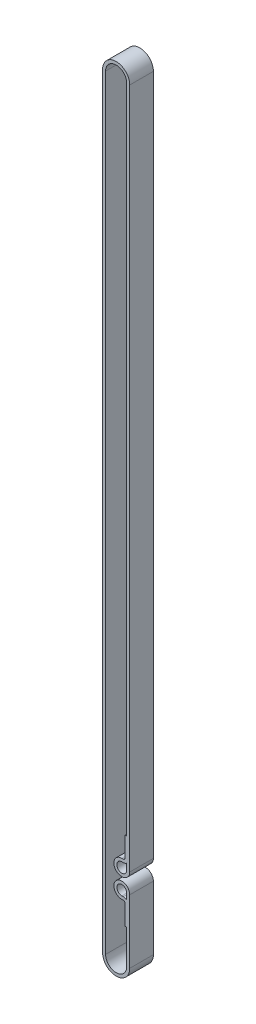
ISO-10303-21;
HEADER;
FILE_DESCRIPTION(('STEP AP214'),'2;1');
FILE_NAME('part.step','',(''),(''),'','','');
FILE_SCHEMA(('AUTOMOTIVE_DESIGN { 1 0 10303 214 1 1 1 1 }'));
ENDSEC;
DATA;
#1=APPLICATION_CONTEXT('core data for automotive mechanical design processes');
#2=APPLICATION_PROTOCOL_DEFINITION('international standard','automotive_design',2000,#1);
#3=PRODUCT_CONTEXT('',#1,'mechanical');
#4=PRODUCT('Part','Part','',(#3));
#5=PRODUCT_RELATED_PRODUCT_CATEGORY('part','',(#4));
#6=PRODUCT_DEFINITION_FORMATION('','',#4);
#7=PRODUCT_DEFINITION_CONTEXT('part definition',#1,'design');
#8=PRODUCT_DEFINITION('design','',#6,#7);
#9=PRODUCT_DEFINITION_SHAPE('','',#8);
#10=(LENGTH_UNIT() NAMED_UNIT(*) SI_UNIT(.MILLI.,.METRE.));
#11=(NAMED_UNIT(*) PLANE_ANGLE_UNIT() SI_UNIT($,.RADIAN.));
#12=(NAMED_UNIT(*) SI_UNIT($,.STERADIAN.) SOLID_ANGLE_UNIT());
#13=UNCERTAINTY_MEASURE_WITH_UNIT(LENGTH_MEASURE(1.E-05),#10,'distance_accuracy_value','');
#14=(GEOMETRIC_REPRESENTATION_CONTEXT(3) GLOBAL_UNCERTAINTY_ASSIGNED_CONTEXT((#13)) GLOBAL_UNIT_ASSIGNED_CONTEXT((#10,
#11,#12)) REPRESENTATION_CONTEXT('',''));
#15=CARTESIAN_POINT('',(0.,0.,0.));
#16=DIRECTION('',(0.,0.,1.));
#17=DIRECTION('',(1.,0.,0.));
#18=AXIS2_PLACEMENT_3D('',#15,#16,#17);
#19=CARTESIAN_POINT('',(4.591,-330.696,12.));
#20=DIRECTION('',(0.,1.,0.));
#21=DIRECTION('',(0.,0.,1.));
#22=AXIS2_PLACEMENT_3D('',#19,#20,#21);
#23=PLANE('',#22);
#24=DIRECTION('',(1.,0.,0.));
#25=VECTOR('',#24,1.);
#26=CARTESIAN_POINT('',(4.591,-330.696,0.));
#27=LINE('',#26,#25);
#28=CARTESIAN_POINT('',(4.591,-330.696,0.));
#29=VERTEX_POINT('',#28);
#30=CARTESIAN_POINT('',(5.361,-330.696,0.));
#31=VERTEX_POINT('',#30);
#32=EDGE_CURVE('E180',#29,#31,#27,.T.);
#33=ORIENTED_EDGE('',*,*,#32,.F.);
#34=DIRECTION('',(0.,0.,-1.));
#35=VECTOR('',#34,1.);
#36=CARTESIAN_POINT('',(4.591,-330.696,12.));
#37=LINE('',#36,#35);
#38=CARTESIAN_POINT('',(4.591,-330.696,12.));
#39=VERTEX_POINT('',#38);
#40=EDGE_CURVE('E11',#39,#29,#37,.T.);
#41=ORIENTED_EDGE('',*,*,#40,.F.);
#42=DIRECTION('',(1.,0.,0.));
#43=VECTOR('',#42,1.);
#44=CARTESIAN_POINT('',(4.591,-330.696,12.));
#45=LINE('',#44,#43);
#46=CARTESIAN_POINT('',(5.361,-330.696,12.));
#47=VERTEX_POINT('',#46);
#48=EDGE_CURVE('E223',#39,#47,#45,.T.);
#49=ORIENTED_EDGE('',*,*,#48,.T.);
#50=DIRECTION('',(0.,0.,1.));
#51=VECTOR('',#50,1.);
#52=CARTESIAN_POINT('',(5.361,-330.696,-400.932146129492));
#53=LINE('',#52,#51);
#54=EDGE_CURVE('E309',#31,#47,#53,.T.);
#55=ORIENTED_EDGE('',*,*,#54,.F.);
#56=EDGE_LOOP('',(#33,#41,#49,#55));
#57=FACE_BOUND('',#56,.T.);
#58=ADVANCED_FACE('F41',(#57),#23,.T.);
#59=CARTESIAN_POINT('',(4.591,-330.696,12.));
#60=DIRECTION('',(-1.,0.,0.));
#61=DIRECTION('',(0.,0.,1.));
#62=AXIS2_PLACEMENT_3D('',#59,#60,#61);
#63=PLANE('',#62);
#64=DIRECTION('',(0.,1.,0.));
#65=VECTOR('',#64,1.);
#66=CARTESIAN_POINT('',(4.591,-330.696,0.));
#67=LINE('',#66,#65);
#68=CARTESIAN_POINT('',(4.591,-340.696,0.));
#69=VERTEX_POINT('',#68);
#70=EDGE_CURVE('E183',#69,#29,#67,.T.);
#71=ORIENTED_EDGE('',*,*,#70,.F.);
#72=DIRECTION('',(0.,0.,-1.));
#73=VECTOR('',#72,1.);
#74=CARTESIAN_POINT('',(4.591,-340.696,12.));
#75=LINE('',#74,#73);
#76=CARTESIAN_POINT('',(4.591,-340.696,12.));
#77=VERTEX_POINT('',#76);
#78=EDGE_CURVE('E49',#77,#69,#75,.T.);
#79=ORIENTED_EDGE('',*,*,#78,.F.);
#80=DIRECTION('',(0.,1.,0.));
#81=VECTOR('',#80,1.);
#82=CARTESIAN_POINT('',(4.591,-330.696,12.));
#83=LINE('',#82,#81);
#84=EDGE_CURVE('E265',#77,#39,#83,.T.);
#85=ORIENTED_EDGE('',*,*,#84,.T.);
#86=ORIENTED_EDGE('',*,*,#40,.T.);
#87=EDGE_LOOP('',(#71,#79,#85,#86));
#88=FACE_BOUND('',#87,.T.);
#89=ADVANCED_FACE('F252',(#88),#63,.T.);
#90=CARTESIAN_POINT('',(3.607,-340.696,12.));
#91=DIRECTION('',(0.,0.,-1.));
#92=DIRECTION('',(-1.,0.,0.));
#93=AXIS2_PLACEMENT_3D('',#90,#91,#92);
#94=CYLINDRICAL_SURFACE('',#93,0.984000000000001);
#95=CARTESIAN_POINT('',(3.607,-340.696,0.));
#96=DIRECTION('',(0.,0.,1.));
#97=DIRECTION('',(1.,0.,0.));
#98=AXIS2_PLACEMENT_3D('',#95,#96,#97);
#99=CIRCLE('',#98,0.984000000000001);
#100=CARTESIAN_POINT('',(3.607,-341.68,0.));
#101=VERTEX_POINT('',#100);
#102=EDGE_CURVE('E187',#101,#69,#99,.T.);
#103=ORIENTED_EDGE('',*,*,#102,.F.);
#104=DIRECTION('',(0.,0.,-1.));
#105=VECTOR('',#104,1.);
#106=CARTESIAN_POINT('',(3.607,-341.68,12.));
#107=LINE('',#106,#105);
#108=CARTESIAN_POINT('',(3.607,-341.68,12.));
#109=VERTEX_POINT('',#108);
#110=EDGE_CURVE('E241',#109,#101,#107,.T.);
#111=ORIENTED_EDGE('',*,*,#110,.F.);
#112=CARTESIAN_POINT('',(3.607,-340.696,12.));
#113=DIRECTION('',(0.,0.,1.));
#114=DIRECTION('',(1.,0.,0.));
#115=AXIS2_PLACEMENT_3D('',#112,#113,#114);
#116=CIRCLE('',#115,0.984000000000001);
#117=EDGE_CURVE('E248',#109,#77,#116,.T.);
#118=ORIENTED_EDGE('',*,*,#117,.T.);
#119=ORIENTED_EDGE('',*,*,#78,.T.);
#120=EDGE_LOOP('',(#103,#111,#118,#119));
#121=FACE_BOUND('',#120,.T.);
#122=ADVANCED_FACE('F246',(#121),#94,.F.);
#123=CARTESIAN_POINT('',(2.861,-341.68,12.));
#124=DIRECTION('',(0.,1.,0.));
#125=DIRECTION('',(0.,0.,1.));
#126=AXIS2_PLACEMENT_3D('',#123,#124,#125);
#127=PLANE('',#126);
#128=DIRECTION('',(1.,0.,0.));
#129=VECTOR('',#128,1.);
#130=CARTESIAN_POINT('',(2.861,-341.68,0.));
#131=LINE('',#130,#129);
#132=CARTESIAN_POINT('',(2.861,-341.68,0.));
#133=VERTEX_POINT('',#132);
#134=EDGE_CURVE('E190',#133,#101,#131,.T.);
#135=ORIENTED_EDGE('',*,*,#134,.F.);
#136=DIRECTION('',(0.,0.,-1.));
#137=VECTOR('',#136,1.);
#138=CARTESIAN_POINT('',(2.861,-341.68,12.));
#139=LINE('',#138,#137);
#140=CARTESIAN_POINT('',(2.861,-341.68,12.));
#141=VERTEX_POINT('',#140);
#142=EDGE_CURVE('E239',#141,#133,#139,.T.);
#143=ORIENTED_EDGE('',*,*,#142,.F.);
#144=DIRECTION('',(1.,0.,0.));
#145=VECTOR('',#144,1.);
#146=CARTESIAN_POINT('',(2.861,-341.68,12.));
#147=LINE('',#146,#145);
#148=EDGE_CURVE('E262',#141,#109,#147,.T.);
#149=ORIENTED_EDGE('',*,*,#148,.T.);
#150=ORIENTED_EDGE('',*,*,#110,.T.);
#151=EDGE_LOOP('',(#135,#143,#149,#150));
#152=FACE_BOUND('',#151,.T.);
#153=ADVANCED_FACE('F259',(#152),#127,.T.);
#154=CARTESIAN_POINT('',(2.861,-345.7,12.));
#155=DIRECTION('',(0.,0.,-1.));
#156=DIRECTION('',(-1.,0.,0.));
#157=AXIS2_PLACEMENT_3D('',#154,#155,#156);
#158=CYLINDRICAL_SURFACE('',#157,4.02);
#159=CARTESIAN_POINT('',(2.861,-345.7,0.));
#160=DIRECTION('',(0.,0.,1.));
#161=DIRECTION('',(1.,0.,0.));
#162=AXIS2_PLACEMENT_3D('',#159,#160,#161);
#163=CIRCLE('',#162,4.02);
#164=CARTESIAN_POINT('',(6.881,-345.7,0.));
#165=VERTEX_POINT('',#164);
#166=EDGE_CURVE('E193',#165,#133,#163,.F.);
#167=ORIENTED_EDGE('',*,*,#166,.F.);
#168=DIRECTION('',(0.,0.,-1.));
#169=VECTOR('',#168,1.);
#170=CARTESIAN_POINT('',(6.881,-345.7,12.));
#171=LINE('',#170,#169);
#172=CARTESIAN_POINT('',(6.881,-345.7,12.));
#173=VERTEX_POINT('',#172);
#174=EDGE_CURVE('E237',#173,#165,#171,.T.);
#175=ORIENTED_EDGE('',*,*,#174,.F.);
#176=CARTESIAN_POINT('',(2.861,-345.7,12.));
#177=DIRECTION('',(0.,0.,1.));
#178=DIRECTION('',(1.,0.,0.));
#179=AXIS2_PLACEMENT_3D('',#176,#177,#178);
#180=CIRCLE('',#179,4.02);
#181=EDGE_CURVE('E267',#173,#141,#180,.F.);
#182=ORIENTED_EDGE('',*,*,#181,.T.);
#183=ORIENTED_EDGE('',*,*,#142,.T.);
#184=EDGE_LOOP('',(#167,#175,#182,#183));
#185=FACE_BOUND('',#184,.T.);
#186=ADVANCED_FACE('F755',(#185),#158,.T.);
#187=CARTESIAN_POINT('',(6.881,-345.7,12.));
#188=DIRECTION('',(1.,0.,0.));
#189=DIRECTION('',(0.,0.,-1.));
#190=AXIS2_PLACEMENT_3D('',#187,#188,#189);
#191=PLANE('',#190);
#192=DIRECTION('',(0.,1.,0.));
#193=VECTOR('',#192,1.);
#194=CARTESIAN_POINT('',(6.881,-345.7,0.));
#195=LINE('',#194,#193);
#196=CARTESIAN_POINT('',(6.881,0.,0.));
#197=VERTEX_POINT('',#196);
#198=EDGE_CURVE('E196',#197,#165,#195,.F.);
#199=ORIENTED_EDGE('',*,*,#198,.F.);
#200=DIRECTION('',(0.,0.,-1.));
#201=VECTOR('',#200,1.);
#202=CARTESIAN_POINT('',(6.881,0.,12.));
#203=LINE('',#202,#201);
#204=CARTESIAN_POINT('',(6.881,0.,12.));
#205=VERTEX_POINT('',#204);
#206=EDGE_CURVE('E235',#205,#197,#203,.T.);
#207=ORIENTED_EDGE('',*,*,#206,.F.);
#208=DIRECTION('',(0.,1.,0.));
#209=VECTOR('',#208,1.);
#210=CARTESIAN_POINT('',(6.881,-345.7,12.));
#211=LINE('',#210,#209);
#212=EDGE_CURVE('E273',#205,#173,#211,.F.);
#213=ORIENTED_EDGE('',*,*,#212,.T.);
#214=ORIENTED_EDGE('',*,*,#174,.T.);
#215=EDGE_LOOP('',(#199,#207,#213,#214));
#216=FACE_BOUND('',#215,.T.);
#217=ADVANCED_FACE('F631',(#216),#191,.T.);
#218=CARTESIAN_POINT('',(0.,0.,12.));
#219=DIRECTION('',(0.,0.,-1.));
#220=DIRECTION('',(-1.,0.,0.));
#221=AXIS2_PLACEMENT_3D('',#218,#219,#220);
#222=CYLINDRICAL_SURFACE('',#221,6.881);
#223=CARTESIAN_POINT('',(0.,0.,0.));
#224=DIRECTION('',(0.,0.,1.));
#225=DIRECTION('',(1.,0.,0.));
#226=AXIS2_PLACEMENT_3D('',#223,#224,#225);
#227=CIRCLE('',#226,6.881);
#228=CARTESIAN_POINT('',(-6.881,0.,0.));
#229=VERTEX_POINT('',#228);
#230=EDGE_CURVE('E199',#229,#197,#227,.F.);
#231=ORIENTED_EDGE('',*,*,#230,.F.);
#232=DIRECTION('',(0.,0.,-1.));
#233=VECTOR('',#232,1.);
#234=CARTESIAN_POINT('',(-6.881,0.,12.));
#235=LINE('',#234,#233);
#236=CARTESIAN_POINT('',(-6.881,0.,12.));
#237=VERTEX_POINT('',#236);
#238=EDGE_CURVE('E233',#237,#229,#235,.T.);
#239=ORIENTED_EDGE('',*,*,#238,.F.);
#240=CARTESIAN_POINT('',(0.,0.,12.));
#241=DIRECTION('',(0.,0.,1.));
#242=DIRECTION('',(1.,0.,0.));
#243=AXIS2_PLACEMENT_3D('',#240,#241,#242);
#244=CIRCLE('',#243,6.881);
#245=EDGE_CURVE('E276',#237,#205,#244,.F.);
#246=ORIENTED_EDGE('',*,*,#245,.T.);
#247=ORIENTED_EDGE('',*,*,#206,.T.);
#248=EDGE_LOOP('',(#231,#239,#246,#247));
#249=FACE_BOUND('',#248,.T.);
#250=ADVANCED_FACE('F625',(#249),#222,.T.);
#251=CARTESIAN_POINT('',(-6.881,0.,12.));
#252=DIRECTION('',(-1.,0.,0.));
#253=DIRECTION('',(0.,0.,1.));
#254=AXIS2_PLACEMENT_3D('',#251,#252,#253);
#255=PLANE('',#254);
#256=DIRECTION('',(0.,1.,0.));
#257=VECTOR('',#256,1.);
#258=CARTESIAN_POINT('',(-6.881,0.,0.));
#259=LINE('',#258,#257);
#260=CARTESIAN_POINT('',(-6.881,-388.,0.));
#261=VERTEX_POINT('',#260);
#262=EDGE_CURVE('E202',#261,#229,#259,.T.);
#263=ORIENTED_EDGE('',*,*,#262,.F.);
#264=DIRECTION('',(0.,0.,-1.));
#265=VECTOR('',#264,1.);
#266=CARTESIAN_POINT('',(-6.881,-388.,12.));
#267=LINE('',#266,#265);
#268=CARTESIAN_POINT('',(-6.881,-388.,12.));
#269=VERTEX_POINT('',#268);
#270=EDGE_CURVE('E231',#269,#261,#267,.T.);
#271=ORIENTED_EDGE('',*,*,#270,.F.);
#272=DIRECTION('',(0.,1.,0.));
#273=VECTOR('',#272,1.);
#274=CARTESIAN_POINT('',(-6.881,0.,12.));
#275=LINE('',#274,#273);
#276=EDGE_CURVE('E279',#269,#237,#275,.T.);
#277=ORIENTED_EDGE('',*,*,#276,.T.);
#278=ORIENTED_EDGE('',*,*,#238,.T.);
#279=EDGE_LOOP('',(#263,#271,#277,#278));
#280=FACE_BOUND('',#279,.T.);
#281=ADVANCED_FACE('F630',(#280),#255,.T.);
#282=CARTESIAN_POINT('',(0.,-388.,12.));
#283=DIRECTION('',(0.,0.,-1.));
#284=DIRECTION('',(-1.,0.,0.));
#285=AXIS2_PLACEMENT_3D('',#282,#283,#284);
#286=CYLINDRICAL_SURFACE('',#285,6.881);
#287=CARTESIAN_POINT('',(0.,-388.,0.));
#288=DIRECTION('',(0.,0.,1.));
#289=DIRECTION('',(1.,0.,0.));
#290=AXIS2_PLACEMENT_3D('',#287,#288,#289);
#291=CIRCLE('',#290,6.881);
#292=CARTESIAN_POINT('',(6.881,-388.,0.));
#293=VERTEX_POINT('',#292);
#294=EDGE_CURVE('E205',#293,#261,#291,.F.);
#295=ORIENTED_EDGE('',*,*,#294,.F.);
#296=DIRECTION('',(0.,0.,-1.));
#297=VECTOR('',#296,1.);
#298=CARTESIAN_POINT('',(6.881,-388.,12.));
#299=LINE('',#298,#297);
#300=CARTESIAN_POINT('',(6.881,-388.,12.));
#301=VERTEX_POINT('',#300);
#302=EDGE_CURVE('E229',#301,#293,#299,.T.);
#303=ORIENTED_EDGE('',*,*,#302,.F.);
#304=CARTESIAN_POINT('',(0.,-388.,12.));
#305=DIRECTION('',(0.,0.,1.));
#306=DIRECTION('',(1.,0.,0.));
#307=AXIS2_PLACEMENT_3D('',#304,#305,#306);
#308=CIRCLE('',#307,6.881);
#309=EDGE_CURVE('E282',#301,#269,#308,.F.);
#310=ORIENTED_EDGE('',*,*,#309,.T.);
#311=ORIENTED_EDGE('',*,*,#270,.T.);
#312=EDGE_LOOP('',(#295,#303,#310,#311));
#313=FACE_BOUND('',#312,.T.);
#314=ADVANCED_FACE('F615',(#313),#286,.T.);
#315=CARTESIAN_POINT('',(6.881,-388.,12.));
#316=DIRECTION('',(1.,0.,0.));
#317=DIRECTION('',(0.,0.,-1.));
#318=AXIS2_PLACEMENT_3D('',#315,#316,#317);
#319=PLANE('',#318);
#320=DIRECTION('',(0.,1.,0.));
#321=VECTOR('',#320,1.);
#322=CARTESIAN_POINT('',(6.881,-388.,0.));
#323=LINE('',#322,#321);
#324=CARTESIAN_POINT('',(6.881,-355.7,0.));
#325=VERTEX_POINT('',#324);
#326=EDGE_CURVE('E208',#325,#293,#323,.F.);
#327=ORIENTED_EDGE('',*,*,#326,.F.);
#328=DIRECTION('',(0.,0.,-1.));
#329=VECTOR('',#328,1.);
#330=CARTESIAN_POINT('',(6.881,-355.7,12.));
#331=LINE('',#330,#329);
#332=CARTESIAN_POINT('',(6.881,-355.7,12.));
#333=VERTEX_POINT('',#332);
#334=EDGE_CURVE('E227',#333,#325,#331,.T.);
#335=ORIENTED_EDGE('',*,*,#334,.F.);
#336=DIRECTION('',(0.,1.,0.));
#337=VECTOR('',#336,1.);
#338=CARTESIAN_POINT('',(6.881,-388.,12.));
#339=LINE('',#338,#337);
#340=EDGE_CURVE('E285',#333,#301,#339,.F.);
#341=ORIENTED_EDGE('',*,*,#340,.T.);
#342=ORIENTED_EDGE('',*,*,#302,.T.);
#343=EDGE_LOOP('',(#327,#335,#341,#342));
#344=FACE_BOUND('',#343,.T.);
#345=ADVANCED_FACE('F610',(#344),#319,.T.);
#346=CARTESIAN_POINT('',(2.861,-355.7,12.));
#347=DIRECTION('',(0.,0.,-1.));
#348=DIRECTION('',(-1.,0.,0.));
#349=AXIS2_PLACEMENT_3D('',#346,#347,#348);
#350=CYLINDRICAL_SURFACE('',#349,4.02);
#351=CARTESIAN_POINT('',(2.861,-355.7,0.));
#352=DIRECTION('',(0.,0.,1.));
#353=DIRECTION('',(1.,0.,0.));
#354=AXIS2_PLACEMENT_3D('',#351,#352,#353);
#355=CIRCLE('',#354,4.02);
#356=CARTESIAN_POINT('',(2.861,-359.72,0.));
#357=VERTEX_POINT('',#356);
#358=EDGE_CURVE('E211',#357,#325,#355,.F.);
#359=ORIENTED_EDGE('',*,*,#358,.F.);
#360=DIRECTION('',(0.,0.,-1.));
#361=VECTOR('',#360,1.);
#362=CARTESIAN_POINT('',(2.861,-359.72,12.));
#363=LINE('',#362,#361);
#364=CARTESIAN_POINT('',(2.861,-359.72,12.));
#365=VERTEX_POINT('',#364);
#366=EDGE_CURVE('E159',#365,#357,#363,.T.);
#367=ORIENTED_EDGE('',*,*,#366,.F.);
#368=CARTESIAN_POINT('',(2.861,-355.7,12.));
#369=DIRECTION('',(0.,0.,1.));
#370=DIRECTION('',(1.,0.,0.));
#371=AXIS2_PLACEMENT_3D('',#368,#369,#370);
#372=CIRCLE('',#371,4.02);
#373=EDGE_CURVE('E170',#365,#333,#372,.F.);
#374=ORIENTED_EDGE('',*,*,#373,.T.);
#375=ORIENTED_EDGE('',*,*,#334,.T.);
#376=EDGE_LOOP('',(#359,#367,#374,#375));
#377=FACE_BOUND('',#376,.T.);
#378=ADVANCED_FACE('F289',(#377),#350,.T.);
#379=CARTESIAN_POINT('',(2.861,-359.72,12.));
#380=DIRECTION('',(0.,-1.,0.));
#381=DIRECTION('',(0.,0.,-1.));
#382=AXIS2_PLACEMENT_3D('',#379,#380,#381);
#383=PLANE('',#382);
#384=DIRECTION('',(1.,0.,0.));
#385=VECTOR('',#384,1.);
#386=CARTESIAN_POINT('',(2.861,-359.72,0.));
#387=LINE('',#386,#385);
#388=CARTESIAN_POINT('',(3.607,-359.72,0.));
#389=VERTEX_POINT('',#388);
#390=EDGE_CURVE('E155',#389,#357,#387,.F.);
#391=ORIENTED_EDGE('',*,*,#390,.F.);
#392=DIRECTION('',(0.,0.,-1.));
#393=VECTOR('',#392,1.);
#394=CARTESIAN_POINT('',(3.607,-359.72,12.));
#395=LINE('',#394,#393);
#396=CARTESIAN_POINT('',(3.607,-359.72,12.));
#397=VERTEX_POINT('',#396);
#398=EDGE_CURVE('E150',#397,#389,#395,.T.);
#399=ORIENTED_EDGE('',*,*,#398,.F.);
#400=DIRECTION('',(1.,0.,0.));
#401=VECTOR('',#400,1.);
#402=CARTESIAN_POINT('',(2.861,-359.72,12.));
#403=LINE('',#402,#401);
#404=EDGE_CURVE('E153',#397,#365,#403,.F.);
#405=ORIENTED_EDGE('',*,*,#404,.T.);
#406=ORIENTED_EDGE('',*,*,#366,.T.);
#407=EDGE_LOOP('',(#391,#399,#405,#406));
#408=FACE_BOUND('',#407,.T.);
#409=ADVANCED_FACE('F152',(#408),#383,.T.);
#410=CARTESIAN_POINT('',(3.607,-360.704,12.));
#411=DIRECTION('',(0.,0.,-1.));
#412=DIRECTION('',(-1.,0.,0.));
#413=AXIS2_PLACEMENT_3D('',#410,#411,#412);
#414=CYLINDRICAL_SURFACE('',#413,0.984000000000001);
#415=CARTESIAN_POINT('',(3.607,-360.704,0.));
#416=DIRECTION('',(0.,0.,1.));
#417=DIRECTION('',(1.,0.,0.));
#418=AXIS2_PLACEMENT_3D('',#415,#416,#417);
#419=CIRCLE('',#418,0.984000000000001);
#420=CARTESIAN_POINT('',(4.591,-360.704,0.));
#421=VERTEX_POINT('',#420);
#422=EDGE_CURVE('E215',#421,#389,#419,.T.);
#423=ORIENTED_EDGE('',*,*,#422,.F.);
#424=DIRECTION('',(0.,0.,-1.));
#425=VECTOR('',#424,1.);
#426=CARTESIAN_POINT('',(4.591,-360.704,12.));
#427=LINE('',#426,#425);
#428=CARTESIAN_POINT('',(4.591,-360.704,12.));
#429=VERTEX_POINT('',#428);
#430=EDGE_CURVE('E101',#429,#421,#427,.T.);
#431=ORIENTED_EDGE('',*,*,#430,.F.);
#432=CARTESIAN_POINT('',(3.607,-360.704,12.));
#433=DIRECTION('',(0.,0.,1.));
#434=DIRECTION('',(1.,0.,0.));
#435=AXIS2_PLACEMENT_3D('',#432,#433,#434);
#436=CIRCLE('',#435,0.984000000000001);
#437=EDGE_CURVE('E167',#429,#397,#436,.T.);
#438=ORIENTED_EDGE('',*,*,#437,.T.);
#439=ORIENTED_EDGE('',*,*,#398,.T.);
#440=EDGE_LOOP('',(#423,#431,#438,#439));
#441=FACE_BOUND('',#440,.T.);
#442=ADVANCED_FACE('F172',(#441),#414,.F.);
#443=CARTESIAN_POINT('',(4.591,-370.704,12.));
#444=DIRECTION('',(-1.,0.,0.));
#445=DIRECTION('',(0.,0.,1.));
#446=AXIS2_PLACEMENT_3D('',#443,#444,#445);
#447=PLANE('',#446);
#448=DIRECTION('',(0.,1.,0.));
#449=VECTOR('',#448,1.);
#450=CARTESIAN_POINT('',(4.591,-370.704,0.));
#451=LINE('',#450,#449);
#452=CARTESIAN_POINT('',(4.591,-370.704,0.));
#453=VERTEX_POINT('',#452);
#454=EDGE_CURVE('E217',#453,#421,#451,.T.);
#455=ORIENTED_EDGE('',*,*,#454,.F.);
#456=DIRECTION('',(0.,0.,-1.));
#457=VECTOR('',#456,1.);
#458=CARTESIAN_POINT('',(4.591,-370.704,12.));
#459=LINE('',#458,#457);
#460=CARTESIAN_POINT('',(4.591,-370.704,12.));
#461=VERTEX_POINT('',#460);
#462=EDGE_CURVE('E57',#461,#453,#459,.T.);
#463=ORIENTED_EDGE('',*,*,#462,.F.);
#464=DIRECTION('',(0.,1.,0.));
#465=VECTOR('',#464,1.);
#466=CARTESIAN_POINT('',(4.591,-370.704,12.));
#467=LINE('',#466,#465);
#468=EDGE_CURVE('E173',#461,#429,#467,.T.);
#469=ORIENTED_EDGE('',*,*,#468,.T.);
#470=ORIENTED_EDGE('',*,*,#430,.T.);
#471=EDGE_LOOP('',(#455,#463,#469,#470));
#472=FACE_BOUND('',#471,.T.);
#473=ADVANCED_FACE('F292',(#472),#447,.T.);
#474=CARTESIAN_POINT('',(5.107,-370.704,12.));
#475=DIRECTION('',(0.,-1.,0.));
#476=DIRECTION('',(0.,0.,-1.));
#477=AXIS2_PLACEMENT_3D('',#474,#475,#476);
#478=PLANE('',#477);
#479=DIRECTION('',(-1.,0.,0.));
#480=VECTOR('',#479,1.);
#481=CARTESIAN_POINT('',(5.107,-370.704,0.));
#482=LINE('',#481,#480);
#483=CARTESIAN_POINT('',(5.361,-370.704,0.));
#484=VERTEX_POINT('',#483);
#485=EDGE_CURVE('E220',#484,#453,#482,.T.);
#486=ORIENTED_EDGE('',*,*,#485,.F.);
#487=DIRECTION('',(0.,0.,1.));
#488=VECTOR('',#487,1.);
#489=CARTESIAN_POINT('',(5.361,-370.704,-400.932146129492));
#490=LINE('',#489,#488);
#491=CARTESIAN_POINT('',(5.361,-370.704,12.));
#492=VERTEX_POINT('',#491);
#493=EDGE_CURVE('E403',#484,#492,#490,.T.);
#494=ORIENTED_EDGE('',*,*,#493,.T.);
#495=DIRECTION('',(-1.,0.,0.));
#496=VECTOR('',#495,1.);
#497=CARTESIAN_POINT('',(5.107,-370.704,12.));
#498=LINE('',#497,#496);
#499=EDGE_CURVE('E175',#492,#461,#498,.T.);
#500=ORIENTED_EDGE('',*,*,#499,.T.);
#501=ORIENTED_EDGE('',*,*,#462,.T.);
#502=EDGE_LOOP('',(#486,#494,#500,#501));
#503=FACE_BOUND('',#502,.T.);
#504=ADVANCED_FACE('F294',(#503),#478,.T.);
#505=CARTESIAN_POINT('',(3.607,-340.696,12.));
#506=DIRECTION('',(0.,0.,1.));
#507=DIRECTION('',(1.,0.,0.));
#508=AXIS2_PLACEMENT_3D('',#505,#506,#507);
#509=PLANE('',#508);
#510=ORIENTED_EDGE('',*,*,#499,.F.);
#511=DIRECTION('',(0.,-1.,0.));
#512=VECTOR('',#511,1.);
#513=CARTESIAN_POINT('',(5.36100000000008,0.,12.));
#514=LINE('',#513,#512);
#515=CARTESIAN_POINT('',(5.361,-388.,12.));
#516=VERTEX_POINT('',#515);
#517=EDGE_CURVE('E356',#492,#516,#514,.T.);
#518=ORIENTED_EDGE('',*,*,#517,.T.);
#519=CARTESIAN_POINT('',(0.,-388.,12.));
#520=DIRECTION('',(0.,0.,1.));
#521=DIRECTION('',(1.,0.,0.));
#522=AXIS2_PLACEMENT_3D('',#519,#520,#521);
#523=CIRCLE('',#522,5.361);
#524=CARTESIAN_POINT('',(-5.361,-388.,12.));
#525=VERTEX_POINT('',#524);
#526=EDGE_CURVE('E368',#525,#516,#523,.T.);
#527=ORIENTED_EDGE('',*,*,#526,.F.);
#528=DIRECTION('',(0.,1.,0.));
#529=VECTOR('',#528,1.);
#530=CARTESIAN_POINT('',(-5.361,0.,12.));
#531=LINE('',#530,#529);
#532=CARTESIAN_POINT('',(-5.361,0.,12.));
#533=VERTEX_POINT('',#532);
#534=EDGE_CURVE('E357',#525,#533,#531,.T.);
#535=ORIENTED_EDGE('',*,*,#534,.T.);
#536=CARTESIAN_POINT('',(0.,0.,12.));
#537=DIRECTION('',(0.,0.,1.));
#538=DIRECTION('',(1.,0.,0.));
#539=AXIS2_PLACEMENT_3D('',#536,#537,#538);
#540=CIRCLE('',#539,5.361);
#541=CARTESIAN_POINT('',(5.361,0.,12.));
#542=VERTEX_POINT('',#541);
#543=EDGE_CURVE('E355',#542,#533,#540,.T.);
#544=ORIENTED_EDGE('',*,*,#543,.F.);
#545=DIRECTION('',(0.,-1.,0.));
#546=VECTOR('',#545,1.);
#547=CARTESIAN_POINT('',(5.361,0.,12.));
#548=LINE('',#547,#546);
#549=EDGE_CURVE('E352',#542,#47,#548,.T.);
#550=ORIENTED_EDGE('',*,*,#549,.T.);
#551=ORIENTED_EDGE('',*,*,#48,.F.);
#552=ORIENTED_EDGE('',*,*,#84,.F.);
#553=ORIENTED_EDGE('',*,*,#117,.F.);
#554=ORIENTED_EDGE('',*,*,#148,.F.);
#555=ORIENTED_EDGE('',*,*,#181,.F.);
#556=ORIENTED_EDGE('',*,*,#212,.F.);
#557=ORIENTED_EDGE('',*,*,#245,.F.);
#558=ORIENTED_EDGE('',*,*,#276,.F.);
#559=ORIENTED_EDGE('',*,*,#309,.F.);
#560=ORIENTED_EDGE('',*,*,#340,.F.);
#561=ORIENTED_EDGE('',*,*,#373,.F.);
#562=ORIENTED_EDGE('',*,*,#404,.F.);
#563=ORIENTED_EDGE('',*,*,#437,.F.);
#564=ORIENTED_EDGE('',*,*,#468,.F.);
#565=EDGE_LOOP('',(#510,#518,#527,#535,#544,#550,#551,#552,#553,#554,#555,#556,#557,#558,#559,
#560,#561,#562,#563,#564));
#566=FACE_BOUND('',#565,.T.);
#567=CARTESIAN_POINT('',(2.861,-355.7,12.));
#568=DIRECTION('',(0.,0.,1.));
#569=DIRECTION('',(1.,0.,0.));
#570=AXIS2_PLACEMENT_3D('',#567,#568,#569);
#571=CIRCLE('',#570,2.5);
#572=CARTESIAN_POINT('',(5.361,-355.7,12.));
#573=VERTEX_POINT('',#572);
#574=CARTESIAN_POINT('',(2.861,-358.2,12.));
#575=VERTEX_POINT('',#574);
#576=EDGE_CURVE('E392',#573,#575,#571,.T.);
#577=ORIENTED_EDGE('',*,*,#576,.F.);
#578=DIRECTION('',(0.,-1.,0.));
#579=VECTOR('',#578,1.);
#580=CARTESIAN_POINT('',(5.3610000000001,0.,12.));
#581=LINE('',#580,#579);
#582=CARTESIAN_POINT('',(5.361,-358.916963346767,12.));
#583=VERTEX_POINT('',#582);
#584=EDGE_CURVE('E360',#573,#583,#581,.T.);
#585=ORIENTED_EDGE('',*,*,#584,.T.);
#586=CARTESIAN_POINT('',(3.607,-360.704,12.));
#587=DIRECTION('',(0.,0.,1.));
#588=DIRECTION('',(1.,0.,0.));
#589=AXIS2_PLACEMENT_3D('',#586,#587,#588);
#590=CIRCLE('',#589,2.504);
#591=CARTESIAN_POINT('',(3.607,-358.2,12.));
#592=VERTEX_POINT('',#591);
#593=EDGE_CURVE('E498',#583,#592,#590,.T.);
#594=ORIENTED_EDGE('',*,*,#593,.T.);
#595=DIRECTION('',(-1.,0.,0.));
#596=VECTOR('',#595,1.);
#597=CARTESIAN_POINT('',(0.,-358.2,12.));
#598=LINE('',#597,#596);
#599=EDGE_CURVE('E494',#592,#575,#598,.T.);
#600=ORIENTED_EDGE('',*,*,#599,.T.);
#601=EDGE_LOOP('',(#577,#585,#594,#600));
#602=FACE_BOUND('',#601,.T.);
#603=CARTESIAN_POINT('',(2.861,-345.7,12.));
#604=DIRECTION('',(0.,0.,1.));
#605=DIRECTION('',(1.,0.,0.));
#606=AXIS2_PLACEMENT_3D('',#603,#604,#605);
#607=CIRCLE('',#606,2.5);
#608=CARTESIAN_POINT('',(2.861,-343.2,12.));
#609=VERTEX_POINT('',#608);
#610=CARTESIAN_POINT('',(5.361,-345.7,12.));
#611=VERTEX_POINT('',#610);
#612=EDGE_CURVE('E379',#609,#611,#607,.T.);
#613=ORIENTED_EDGE('',*,*,#612,.F.);
#614=DIRECTION('',(1.,0.,0.));
#615=VECTOR('',#614,1.);
#616=CARTESIAN_POINT('',(0.,-343.2,12.));
#617=LINE('',#616,#615);
#618=CARTESIAN_POINT('',(3.607,-343.2,12.));
#619=VERTEX_POINT('',#618);
#620=EDGE_CURVE('E497',#609,#619,#617,.T.);
#621=ORIENTED_EDGE('',*,*,#620,.T.);
#622=CARTESIAN_POINT('',(3.607,-340.696,12.));
#623=DIRECTION('',(0.,0.,1.));
#624=DIRECTION('',(1.,0.,0.));
#625=AXIS2_PLACEMENT_3D('',#622,#623,#624);
#626=CIRCLE('',#625,2.504);
#627=CARTESIAN_POINT('',(5.361,-342.483036653234,12.));
#628=VERTEX_POINT('',#627);
#629=EDGE_CURVE('E501',#619,#628,#626,.T.);
#630=ORIENTED_EDGE('',*,*,#629,.T.);
#631=DIRECTION('',(0.,-1.,0.));
#632=VECTOR('',#631,1.);
#633=CARTESIAN_POINT('',(5.36099999999963,0.,12.));
#634=LINE('',#633,#632);
#635=EDGE_CURVE('E346',#628,#611,#634,.T.);
#636=ORIENTED_EDGE('',*,*,#635,.T.);
#637=EDGE_LOOP('',(#613,#621,#630,#636));
#638=FACE_BOUND('',#637,.T.);
#639=ADVANCED_FACE('F165',(#566,#602,#638),#509,.T.);
#640=CARTESIAN_POINT('',(3.607,-340.696,0.));
#641=DIRECTION('',(0.,0.,1.));
#642=DIRECTION('',(1.,0.,0.));
#643=AXIS2_PLACEMENT_3D('',#640,#641,#642);
#644=PLANE('',#643);
#645=ORIENTED_EDGE('',*,*,#32,.T.);
#646=DIRECTION('',(0.,1.,0.));
#647=VECTOR('',#646,1.);
#648=CARTESIAN_POINT('',(5.361,0.,0.));
#649=LINE('',#648,#647);
#650=CARTESIAN_POINT('',(5.361,0.,0.));
#651=VERTEX_POINT('',#650);
#652=EDGE_CURVE('E314',#31,#651,#649,.T.);
#653=ORIENTED_EDGE('',*,*,#652,.T.);
#654=CARTESIAN_POINT('',(0.,0.,0.));
#655=DIRECTION('',(0.,0.,1.));
#656=DIRECTION('',(1.,0.,0.));
#657=AXIS2_PLACEMENT_3D('',#654,#655,#656);
#658=CIRCLE('',#657,5.361);
#659=CARTESIAN_POINT('',(-5.361,0.,0.));
#660=VERTEX_POINT('',#659);
#661=EDGE_CURVE('E336',#660,#651,#658,.F.);
#662=ORIENTED_EDGE('',*,*,#661,.F.);
#663=DIRECTION('',(0.,-1.,0.));
#664=VECTOR('',#663,1.);
#665=CARTESIAN_POINT('',(-5.361,0.,0.));
#666=LINE('',#665,#664);
#667=CARTESIAN_POINT('',(-5.361,-388.,0.));
#668=VERTEX_POINT('',#667);
#669=EDGE_CURVE('E326',#660,#668,#666,.T.);
#670=ORIENTED_EDGE('',*,*,#669,.T.);
#671=CARTESIAN_POINT('',(0.,-388.,0.));
#672=DIRECTION('',(0.,0.,1.));
#673=DIRECTION('',(1.,0.,0.));
#674=AXIS2_PLACEMENT_3D('',#671,#672,#673);
#675=CIRCLE('',#674,5.361);
#676=CARTESIAN_POINT('',(5.361,-388.,0.));
#677=VERTEX_POINT('',#676);
#678=EDGE_CURVE('E395',#677,#668,#675,.F.);
#679=ORIENTED_EDGE('',*,*,#678,.F.);
#680=DIRECTION('',(0.,1.,0.));
#681=VECTOR('',#680,1.);
#682=CARTESIAN_POINT('',(5.36100000000008,0.,0.));
#683=LINE('',#682,#681);
#684=EDGE_CURVE('E327',#677,#484,#683,.T.);
#685=ORIENTED_EDGE('',*,*,#684,.T.);
#686=ORIENTED_EDGE('',*,*,#485,.T.);
#687=ORIENTED_EDGE('',*,*,#454,.T.);
#688=ORIENTED_EDGE('',*,*,#422,.T.);
#689=ORIENTED_EDGE('',*,*,#390,.T.);
#690=ORIENTED_EDGE('',*,*,#358,.T.);
#691=ORIENTED_EDGE('',*,*,#326,.T.);
#692=ORIENTED_EDGE('',*,*,#294,.T.);
#693=ORIENTED_EDGE('',*,*,#262,.T.);
#694=ORIENTED_EDGE('',*,*,#230,.T.);
#695=ORIENTED_EDGE('',*,*,#198,.T.);
#696=ORIENTED_EDGE('',*,*,#166,.T.);
#697=ORIENTED_EDGE('',*,*,#134,.T.);
#698=ORIENTED_EDGE('',*,*,#102,.T.);
#699=ORIENTED_EDGE('',*,*,#70,.T.);
#700=EDGE_LOOP('',(#645,#653,#662,#670,#679,#685,#686,#687,#688,#689,#690,#691,#692,#693,#694,
#695,#696,#697,#698,#699));
#701=FACE_BOUND('',#700,.T.);
#702=DIRECTION('',(0.,1.,0.));
#703=VECTOR('',#702,1.);
#704=CARTESIAN_POINT('',(5.36099999999963,0.,0.));
#705=LINE('',#704,#703);
#706=CARTESIAN_POINT('',(5.361,-345.7,0.));
#707=VERTEX_POINT('',#706);
#708=CARTESIAN_POINT('',(5.36100000000001,-342.483036653234,0.));
#709=VERTEX_POINT('',#708);
#710=EDGE_CURVE('E342',#707,#709,#705,.T.);
#711=ORIENTED_EDGE('',*,*,#710,.T.);
#712=CARTESIAN_POINT('',(3.607,-340.696,0.));
#713=DIRECTION('',(0.,0.,1.));
#714=DIRECTION('',(1.,0.,0.));
#715=AXIS2_PLACEMENT_3D('',#712,#713,#714);
#716=CIRCLE('',#715,2.504);
#717=CARTESIAN_POINT('',(3.607,-343.2,0.));
#718=VERTEX_POINT('',#717);
#719=EDGE_CURVE('E345',#709,#718,#716,.F.);
#720=ORIENTED_EDGE('',*,*,#719,.T.);
#721=DIRECTION('',(-1.,0.,0.));
#722=VECTOR('',#721,1.);
#723=CARTESIAN_POINT('',(0.,-343.2,0.));
#724=LINE('',#723,#722);
#725=CARTESIAN_POINT('',(2.861,-343.2,0.));
#726=VERTEX_POINT('',#725);
#727=EDGE_CURVE('E332',#718,#726,#724,.T.);
#728=ORIENTED_EDGE('',*,*,#727,.T.);
#729=CARTESIAN_POINT('',(2.861,-345.7,0.));
#730=DIRECTION('',(0.,0.,1.));
#731=DIRECTION('',(1.,0.,0.));
#732=AXIS2_PLACEMENT_3D('',#729,#730,#731);
#733=CIRCLE('',#732,2.5);
#734=EDGE_CURVE('E338',#707,#726,#733,.F.);
#735=ORIENTED_EDGE('',*,*,#734,.F.);
#736=EDGE_LOOP('',(#711,#720,#728,#735));
#737=FACE_BOUND('',#736,.T.);
#738=DIRECTION('',(1.,0.,0.));
#739=VECTOR('',#738,1.);
#740=CARTESIAN_POINT('',(0.,-358.2,0.));
#741=LINE('',#740,#739);
#742=CARTESIAN_POINT('',(2.861,-358.2,0.));
#743=VERTEX_POINT('',#742);
#744=CARTESIAN_POINT('',(3.607,-358.2,0.));
#745=VERTEX_POINT('',#744);
#746=EDGE_CURVE('E330',#743,#745,#741,.T.);
#747=ORIENTED_EDGE('',*,*,#746,.T.);
#748=CARTESIAN_POINT('',(3.607,-360.704,0.));
#749=DIRECTION('',(0.,0.,1.));
#750=DIRECTION('',(1.,0.,0.));
#751=AXIS2_PLACEMENT_3D('',#748,#749,#750);
#752=CIRCLE('',#751,2.504);
#753=CARTESIAN_POINT('',(5.361,-358.916963346767,0.));
#754=VERTEX_POINT('',#753);
#755=EDGE_CURVE('E416',#745,#754,#752,.F.);
#756=ORIENTED_EDGE('',*,*,#755,.T.);
#757=DIRECTION('',(0.,1.,0.));
#758=VECTOR('',#757,1.);
#759=CARTESIAN_POINT('',(5.3610000000001,0.,0.));
#760=LINE('',#759,#758);
#761=CARTESIAN_POINT('',(5.361,-355.7,0.));
#762=VERTEX_POINT('',#761);
#763=EDGE_CURVE('E184',#754,#762,#760,.T.);
#764=ORIENTED_EDGE('',*,*,#763,.T.);
#765=CARTESIAN_POINT('',(2.861,-355.7,0.));
#766=DIRECTION('',(0.,0.,1.));
#767=DIRECTION('',(1.,0.,0.));
#768=AXIS2_PLACEMENT_3D('',#765,#766,#767);
#769=CIRCLE('',#768,2.5);
#770=EDGE_CURVE('E382',#743,#762,#769,.F.);
#771=ORIENTED_EDGE('',*,*,#770,.F.);
#772=EDGE_LOOP('',(#747,#756,#764,#771));
#773=FACE_BOUND('',#772,.T.);
#774=ADVANCED_FACE('F254',(#701,#737,#773),#644,.F.);
#775=CARTESIAN_POINT('',(2.861,-345.7,-400.932146129492));
#776=DIRECTION('',(0.,0.,1.));
#777=DIRECTION('',(1.,0.,0.));
#778=AXIS2_PLACEMENT_3D('',#775,#776,#777);
#779=CYLINDRICAL_SURFACE('',#778,2.5);
#780=DIRECTION('',(0.,0.,1.));
#781=VECTOR('',#780,1.);
#782=CARTESIAN_POINT('',(5.361,-345.7,-400.932146129492));
#783=LINE('',#782,#781);
#784=EDGE_CURVE('E375',#707,#611,#783,.T.);
#785=ORIENTED_EDGE('',*,*,#784,.F.);
#786=ORIENTED_EDGE('',*,*,#734,.T.);
#787=DIRECTION('',(0.,0.,1.));
#788=VECTOR('',#787,1.);
#789=CARTESIAN_POINT('',(2.861,-343.2,-400.932146129492));
#790=LINE('',#789,#788);
#791=EDGE_CURVE('E341',#726,#609,#790,.T.);
#792=ORIENTED_EDGE('',*,*,#791,.T.);
#793=ORIENTED_EDGE('',*,*,#612,.T.);
#794=EDGE_LOOP('',(#785,#786,#792,#793));
#795=FACE_BOUND('',#794,.T.);
#796=ADVANCED_FACE('F550',(#795),#779,.F.);
#797=CARTESIAN_POINT('',(5.36099999999963,0.,-400.932146129492));
#798=DIRECTION('',(-1.,0.,0.));
#799=DIRECTION('',(0.,-1.,0.));
#800=AXIS2_PLACEMENT_3D('',#797,#798,#799);
#801=PLANE('',#800);
#802=ORIENTED_EDGE('',*,*,#710,.F.);
#803=ORIENTED_EDGE('',*,*,#784,.T.);
#804=ORIENTED_EDGE('',*,*,#635,.F.);
#805=DIRECTION('',(0.,0.,1.));
#806=VECTOR('',#805,1.);
#807=CARTESIAN_POINT('',(5.361,-342.483036653234,-400.932146129492));
#808=LINE('',#807,#806);
#809=EDGE_CURVE('E378',#709,#628,#808,.T.);
#810=ORIENTED_EDGE('',*,*,#809,.F.);
#811=EDGE_LOOP('',(#802,#803,#804,#810));
#812=FACE_BOUND('',#811,.T.);
#813=ADVANCED_FACE('F546',(#812),#801,.T.);
#814=CARTESIAN_POINT('',(3.607,-340.696,-400.932146129492));
#815=DIRECTION('',(0.,0.,1.));
#816=DIRECTION('',(1.,0.,0.));
#817=AXIS2_PLACEMENT_3D('',#814,#815,#816);
#818=CYLINDRICAL_SURFACE('',#817,2.504);
#819=ORIENTED_EDGE('',*,*,#719,.F.);
#820=ORIENTED_EDGE('',*,*,#809,.T.);
#821=ORIENTED_EDGE('',*,*,#629,.F.);
#822=DIRECTION('',(0.,0.,1.));
#823=VECTOR('',#822,1.);
#824=CARTESIAN_POINT('',(3.607,-343.2,-400.932146129492));
#825=LINE('',#824,#823);
#826=EDGE_CURVE('E362',#718,#619,#825,.T.);
#827=ORIENTED_EDGE('',*,*,#826,.F.);
#828=EDGE_LOOP('',(#819,#820,#821,#827));
#829=FACE_BOUND('',#828,.T.);
#830=ADVANCED_FACE('F531',(#829),#818,.T.);
#831=CARTESIAN_POINT('',(2.861,-355.7,-400.932146129492));
#832=DIRECTION('',(0.,0.,1.));
#833=DIRECTION('',(1.,0.,0.));
#834=AXIS2_PLACEMENT_3D('',#831,#832,#833);
#835=CYLINDRICAL_SURFACE('',#834,2.5);
#836=DIRECTION('',(0.,0.,1.));
#837=VECTOR('',#836,1.);
#838=CARTESIAN_POINT('',(2.861,-358.2,-400.932146129492));
#839=LINE('',#838,#837);
#840=EDGE_CURVE('E388',#743,#575,#839,.T.);
#841=ORIENTED_EDGE('',*,*,#840,.F.);
#842=ORIENTED_EDGE('',*,*,#770,.T.);
#843=DIRECTION('',(0.,0.,1.));
#844=VECTOR('',#843,1.);
#845=CARTESIAN_POINT('',(5.361,-355.7,-400.932146129492));
#846=LINE('',#845,#844);
#847=EDGE_CURVE('E398',#762,#573,#846,.T.);
#848=ORIENTED_EDGE('',*,*,#847,.T.);
#849=ORIENTED_EDGE('',*,*,#576,.T.);
#850=EDGE_LOOP('',(#841,#842,#848,#849));
#851=FACE_BOUND('',#850,.T.);
#852=ADVANCED_FACE('F508',(#851),#835,.F.);
#853=CARTESIAN_POINT('',(0.,-358.2,-400.932146129492));
#854=DIRECTION('',(0.,1.,0.));
#855=DIRECTION('',(0.,0.,1.));
#856=AXIS2_PLACEMENT_3D('',#853,#854,#855);
#857=PLANE('',#856);
#858=ORIENTED_EDGE('',*,*,#746,.F.);
#859=ORIENTED_EDGE('',*,*,#840,.T.);
#860=ORIENTED_EDGE('',*,*,#599,.F.);
#861=DIRECTION('',(0.,0.,1.));
#862=VECTOR('',#861,1.);
#863=CARTESIAN_POINT('',(3.607,-358.2,-400.932146129492));
#864=LINE('',#863,#862);
#865=EDGE_CURVE('E391',#745,#592,#864,.T.);
#866=ORIENTED_EDGE('',*,*,#865,.F.);
#867=EDGE_LOOP('',(#858,#859,#860,#866));
#868=FACE_BOUND('',#867,.T.);
#869=ADVANCED_FACE('F492',(#868),#857,.T.);
#870=CARTESIAN_POINT('',(3.607,-360.704,-400.932146129492));
#871=DIRECTION('',(0.,0.,1.));
#872=DIRECTION('',(1.,0.,0.));
#873=AXIS2_PLACEMENT_3D('',#870,#871,#872);
#874=CYLINDRICAL_SURFACE('',#873,2.504);
#875=ORIENTED_EDGE('',*,*,#755,.F.);
#876=ORIENTED_EDGE('',*,*,#865,.T.);
#877=ORIENTED_EDGE('',*,*,#593,.F.);
#878=DIRECTION('',(0.,0.,1.));
#879=VECTOR('',#878,1.);
#880=CARTESIAN_POINT('',(5.361,-358.916963346767,-400.932146129492));
#881=LINE('',#880,#879);
#882=EDGE_CURVE('E366',#754,#583,#881,.T.);
#883=ORIENTED_EDGE('',*,*,#882,.F.);
#884=EDGE_LOOP('',(#875,#876,#877,#883));
#885=FACE_BOUND('',#884,.T.);
#886=ADVANCED_FACE('F487',(#885),#874,.T.);
#887=CARTESIAN_POINT('',(0.,-388.,-400.932146129492));
#888=DIRECTION('',(0.,0.,1.));
#889=DIRECTION('',(1.,0.,0.));
#890=AXIS2_PLACEMENT_3D('',#887,#888,#889);
#891=CYLINDRICAL_SURFACE('',#890,5.361);
#892=DIRECTION('',(0.,0.,1.));
#893=VECTOR('',#892,1.);
#894=CARTESIAN_POINT('',(5.361,-388.,-400.932146129492));
#895=LINE('',#894,#893);
#896=EDGE_CURVE('E371',#677,#516,#895,.T.);
#897=ORIENTED_EDGE('',*,*,#896,.F.);
#898=ORIENTED_EDGE('',*,*,#678,.T.);
#899=DIRECTION('',(0.,0.,1.));
#900=VECTOR('',#899,1.);
#901=CARTESIAN_POINT('',(-5.361,-388.,-400.932146129492));
#902=LINE('',#901,#900);
#903=EDGE_CURVE('E372',#668,#525,#902,.T.);
#904=ORIENTED_EDGE('',*,*,#903,.T.);
#905=ORIENTED_EDGE('',*,*,#526,.T.);
#906=EDGE_LOOP('',(#897,#898,#904,#905));
#907=FACE_BOUND('',#906,.T.);
#908=ADVANCED_FACE('F426',(#907),#891,.F.);
#909=CARTESIAN_POINT('',(5.36100000000008,0.,-400.932146129492));
#910=DIRECTION('',(-1.,0.,0.));
#911=DIRECTION('',(0.,-1.,0.));
#912=AXIS2_PLACEMENT_3D('',#909,#910,#911);
#913=PLANE('',#912);
#914=ORIENTED_EDGE('',*,*,#684,.F.);
#915=ORIENTED_EDGE('',*,*,#896,.T.);
#916=ORIENTED_EDGE('',*,*,#517,.F.);
#917=ORIENTED_EDGE('',*,*,#493,.F.);
#918=EDGE_LOOP('',(#914,#915,#916,#917));
#919=FACE_BOUND('',#918,.T.);
#920=ADVANCED_FACE('F535',(#919),#913,.T.);
#921=CARTESIAN_POINT('',(5.361,0.,-400.932146129492));
#922=DIRECTION('',(-1.,0.,0.));
#923=DIRECTION('',(0.,-1.,0.));
#924=AXIS2_PLACEMENT_3D('',#921,#922,#923);
#925=PLANE('',#924);
#926=ORIENTED_EDGE('',*,*,#652,.F.);
#927=ORIENTED_EDGE('',*,*,#54,.T.);
#928=ORIENTED_EDGE('',*,*,#549,.F.);
#929=DIRECTION('',(0.,0.,1.));
#930=VECTOR('',#929,1.);
#931=CARTESIAN_POINT('',(5.361,0.,-400.932146129492));
#932=LINE('',#931,#930);
#933=EDGE_CURVE('E325',#651,#542,#932,.T.);
#934=ORIENTED_EDGE('',*,*,#933,.F.);
#935=EDGE_LOOP('',(#926,#927,#928,#934));
#936=FACE_BOUND('',#935,.T.);
#937=ADVANCED_FACE('F320',(#936),#925,.T.);
#938=CARTESIAN_POINT('',(0.,0.,-400.932146129492));
#939=DIRECTION('',(0.,0.,1.));
#940=DIRECTION('',(1.,0.,0.));
#941=AXIS2_PLACEMENT_3D('',#938,#939,#940);
#942=CYLINDRICAL_SURFACE('',#941,5.361);
#943=DIRECTION('',(0.,0.,1.));
#944=VECTOR('',#943,1.);
#945=CARTESIAN_POINT('',(-5.361,0.,-400.932146129492));
#946=LINE('',#945,#944);
#947=EDGE_CURVE('E385',#660,#533,#946,.T.);
#948=ORIENTED_EDGE('',*,*,#947,.F.);
#949=ORIENTED_EDGE('',*,*,#661,.T.);
#950=ORIENTED_EDGE('',*,*,#933,.T.);
#951=ORIENTED_EDGE('',*,*,#543,.T.);
#952=EDGE_LOOP('',(#948,#949,#950,#951));
#953=FACE_BOUND('',#952,.T.);
#954=ADVANCED_FACE('F515',(#953),#942,.F.);
#955=CARTESIAN_POINT('',(5.3610000000001,0.,-400.932146129492));
#956=DIRECTION('',(-1.,0.,0.));
#957=DIRECTION('',(0.,-1.,0.));
#958=AXIS2_PLACEMENT_3D('',#955,#956,#957);
#959=PLANE('',#958);
#960=ORIENTED_EDGE('',*,*,#763,.F.);
#961=ORIENTED_EDGE('',*,*,#882,.T.);
#962=ORIENTED_EDGE('',*,*,#584,.F.);
#963=ORIENTED_EDGE('',*,*,#847,.F.);
#964=EDGE_LOOP('',(#960,#961,#962,#963));
#965=FACE_BOUND('',#964,.T.);
#966=ADVANCED_FACE('F513',(#965),#959,.T.);
#967=CARTESIAN_POINT('',(-5.361,0.,-400.932146129492));
#968=DIRECTION('',(1.,0.,0.));
#969=DIRECTION('',(0.,0.,-1.));
#970=AXIS2_PLACEMENT_3D('',#967,#968,#969);
#971=PLANE('',#970);
#972=ORIENTED_EDGE('',*,*,#669,.F.);
#973=ORIENTED_EDGE('',*,*,#947,.T.);
#974=ORIENTED_EDGE('',*,*,#534,.F.);
#975=ORIENTED_EDGE('',*,*,#903,.F.);
#976=EDGE_LOOP('',(#972,#973,#974,#975));
#977=FACE_BOUND('',#976,.T.);
#978=ADVANCED_FACE('F435',(#977),#971,.T.);
#979=CARTESIAN_POINT('',(0.,-343.2,-400.932146129492));
#980=DIRECTION('',(0.,-1.,0.));
#981=DIRECTION('',(0.,0.,-1.));
#982=AXIS2_PLACEMENT_3D('',#979,#980,#981);
#983=PLANE('',#982);
#984=ORIENTED_EDGE('',*,*,#727,.F.);
#985=ORIENTED_EDGE('',*,*,#826,.T.);
#986=ORIENTED_EDGE('',*,*,#620,.F.);
#987=ORIENTED_EDGE('',*,*,#791,.F.);
#988=EDGE_LOOP('',(#984,#985,#986,#987));
#989=FACE_BOUND('',#988,.T.);
#990=ADVANCED_FACE('F521',(#989),#983,.T.);
#991=CLOSED_SHELL('',(#58,#89,#122,#153,#186,#217,#250,#281,#314,#345,#378,#409,#442,#473,#504,
#639,#774,#796,#813,#830,#852,#869,#886,#908,#920,#937,#954,#966,#978,#990));
#992=MANIFOLD_SOLID_BREP('B2',#991);
#993=ADVANCED_BREP_SHAPE_REPRESENTATION('',(#18,#992),#14);
#994=SHAPE_DEFINITION_REPRESENTATION(#9,#993);
ENDSEC;
END-ISO-10303-21;
